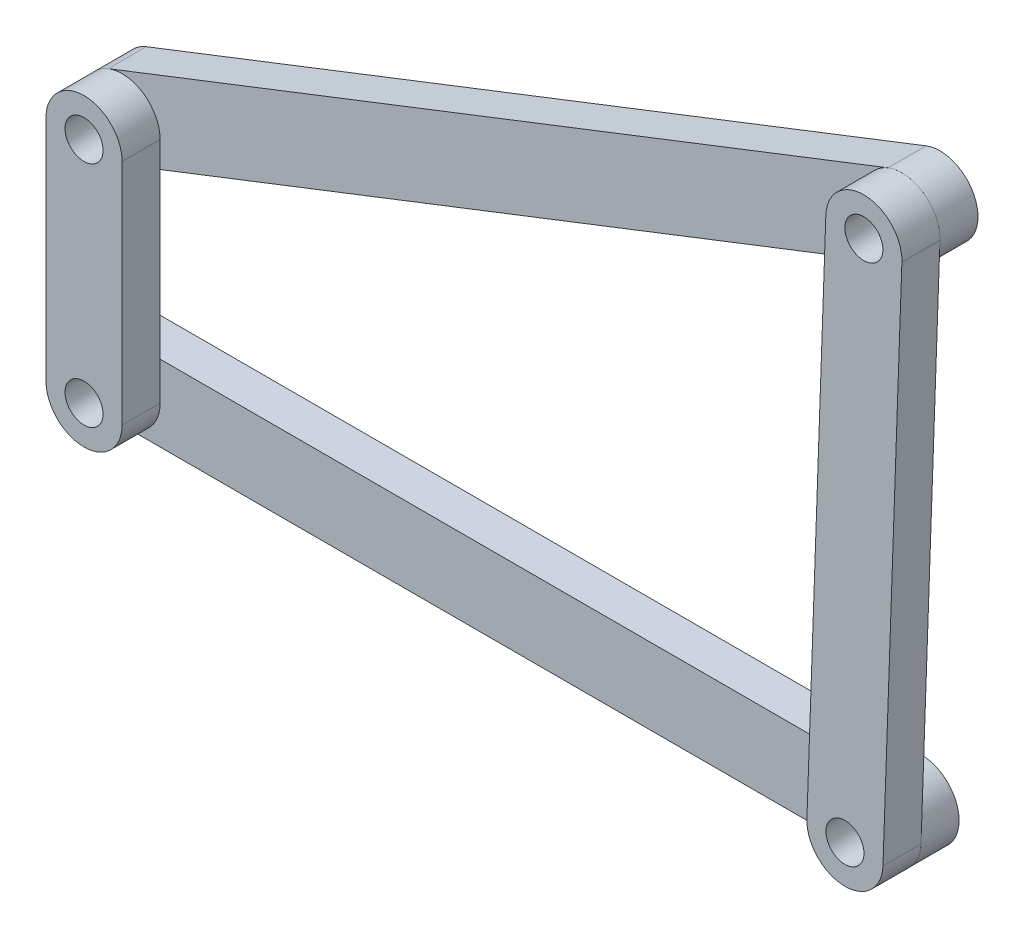
ISO-10303-21;
HEADER;
FILE_DESCRIPTION(('STEP AP214'),'2;1');
FILE_NAME('part.step','',(''),(''),'','','');
FILE_SCHEMA(('AUTOMOTIVE_DESIGN { 1 0 10303 214 1 1 1 1 }'));
ENDSEC;
DATA;
#1=APPLICATION_CONTEXT('core data for automotive mechanical design processes');
#2=APPLICATION_PROTOCOL_DEFINITION('international standard','automotive_design',2000,#1);
#3=PRODUCT_CONTEXT('',#1,'mechanical');
#4=PRODUCT('Part','Part','',(#3));
#5=PRODUCT_RELATED_PRODUCT_CATEGORY('part','',(#4));
#6=PRODUCT_DEFINITION_FORMATION('','',#4);
#7=PRODUCT_DEFINITION_CONTEXT('part definition',#1,'design');
#8=PRODUCT_DEFINITION('design','',#6,#7);
#9=PRODUCT_DEFINITION_SHAPE('','',#8);
#10=(LENGTH_UNIT() NAMED_UNIT(*) SI_UNIT(.MILLI.,.METRE.));
#11=(NAMED_UNIT(*) PLANE_ANGLE_UNIT() SI_UNIT($,.RADIAN.));
#12=(NAMED_UNIT(*) SI_UNIT($,.STERADIAN.) SOLID_ANGLE_UNIT());
#13=UNCERTAINTY_MEASURE_WITH_UNIT(LENGTH_MEASURE(1.E-05),#10,'distance_accuracy_value','');
#14=(GEOMETRIC_REPRESENTATION_CONTEXT(3) GLOBAL_UNCERTAINTY_ASSIGNED_CONTEXT((#13)) GLOBAL_UNIT_ASSIGNED_CONTEXT((#10,
#11,#12)) REPRESENTATION_CONTEXT('',''));
#15=CARTESIAN_POINT('',(0.,0.,0.));
#16=DIRECTION('',(0.,0.,1.));
#17=DIRECTION('',(1.,0.,0.));
#18=AXIS2_PLACEMENT_3D('',#15,#16,#17);
#19=CARTESIAN_POINT('',(0.,30.,0.));
#20=DIRECTION('',(0.,0.,-1.));
#21=DIRECTION('',(-1.,0.,0.));
#22=AXIS2_PLACEMENT_3D('',#19,#20,#21);
#23=PLANE('',#22);
#24=CARTESIAN_POINT('',(0.,30.,0.));
#25=DIRECTION('',(0.,0.,-1.));
#26=DIRECTION('',(-1.,0.,0.));
#27=AXIS2_PLACEMENT_3D('',#24,#25,#26);
#28=CIRCLE('',#27,2.5);
#29=CARTESIAN_POINT('',(-2.5,30.,0.));
#30=VERTEX_POINT('',#29);
#31=EDGE_CURVE('E114',#30,#30,#28,.T.);
#32=ORIENTED_EDGE('',*,*,#31,.F.);
#33=EDGE_LOOP('',(#32));
#34=FACE_BOUND('',#33,.T.);
#35=CARTESIAN_POINT('',(0.,30.,0.));
#36=DIRECTION('',(0.,0.,-1.));
#37=DIRECTION('',(-1.,0.,0.));
#38=AXIS2_PLACEMENT_3D('',#35,#36,#37);
#39=CIRCLE('',#38,5.);
#40=CARTESIAN_POINT('',(1.81617342499557,25.341511608865,0.));
#41=VERTEX_POINT('',#40);
#42=CARTESIAN_POINT('',(-1.81617342499557,34.658488391135,0.));
#43=VERTEX_POINT('',#42);
#44=EDGE_CURVE('E99',#41,#43,#39,.T.);
#45=ORIENTED_EDGE('',*,*,#44,.T.);
#46=DIRECTION('',(0.931697678227007,0.363234684999113,0.));
#47=VECTOR('',#46,1.);
#48=CARTESIAN_POINT('',(-1.81617342499557,34.658488391135,0.));
#49=LINE('',#48,#47);
#50=CARTESIAN_POINT('',(100.670571179975,74.6143037410375,0.));
#51=VERTEX_POINT('',#50);
#52=EDGE_CURVE('E94',#43,#51,#49,.T.);
#53=ORIENTED_EDGE('',*,*,#52,.T.);
#54=CARTESIAN_POINT('',(102.486744604971,69.9558153499025,0.));
#55=DIRECTION('',(0.,0.,-1.));
#56=DIRECTION('',(-1.,0.,0.));
#57=AXIS2_PLACEMENT_3D('',#54,#55,#56);
#58=CIRCLE('',#57,5.00000000000001);
#59=CARTESIAN_POINT('',(104.302918029966,65.2973269587674,0.));
#60=VERTEX_POINT('',#59);
#61=EDGE_CURVE('E97',#51,#60,#58,.T.);
#62=ORIENTED_EDGE('',*,*,#61,.T.);
#63=DIRECTION('',(-0.931697678227007,-0.363234684999113,0.));
#64=VECTOR('',#63,1.);
#65=CARTESIAN_POINT('',(1.81617342499557,25.341511608865,0.));
#66=LINE('',#65,#64);
#67=EDGE_CURVE('E64',#60,#41,#66,.T.);
#68=ORIENTED_EDGE('',*,*,#67,.T.);
#69=EDGE_LOOP('',(#45,#53,#62,#68));
#70=FACE_BOUND('',#69,.T.);
#71=CARTESIAN_POINT('',(102.486744604971,69.9558153499025,0.));
#72=DIRECTION('',(0.,0.,-1.));
#73=DIRECTION('',(-1.,0.,0.));
#74=AXIS2_PLACEMENT_3D('',#71,#72,#73);
#75=CIRCLE('',#74,2.50000000000001);
#76=CARTESIAN_POINT('',(99.9867446049707,69.9558153499025,0.));
#77=VERTEX_POINT('',#76);
#78=EDGE_CURVE('E129',#77,#77,#75,.T.);
#79=ORIENTED_EDGE('',*,*,#78,.F.);
#80=EDGE_LOOP('',(#79));
#81=FACE_BOUND('',#80,.T.);
#82=ADVANCED_FACE('F47',(#34,#70,#81),#23,.T.);
#83=CARTESIAN_POINT('',(-1.81617342499557,34.658488391135,0.));
#84=DIRECTION('',(0.363234684999113,-0.931697678227007,0.));
#85=DIRECTION('',(0.931697678227007,0.363234684999113,0.));
#86=AXIS2_PLACEMENT_3D('',#83,#84,#85);
#87=PLANE('',#86);
#88=DIRECTION('',(0.931697678227007,0.363234684999113,0.));
#89=VECTOR('',#88,1.);
#90=CARTESIAN_POINT('',(-1.81617342499557,34.658488391135,5.));
#91=LINE('',#90,#89);
#92=CARTESIAN_POINT('',(-1.81617342499557,34.658488391135,5.));
#93=VERTEX_POINT('',#92);
#94=CARTESIAN_POINT('',(100.670571179975,74.6143037410375,5.));
#95=VERTEX_POINT('',#94);
#96=EDGE_CURVE('E103',#93,#95,#91,.T.);
#97=ORIENTED_EDGE('',*,*,#96,.T.);
#98=DIRECTION('',(0.,0.,1.));
#99=VECTOR('',#98,1.);
#100=CARTESIAN_POINT('',(100.670571179975,74.6143037410375,0.));
#101=LINE('',#100,#99);
#102=EDGE_CURVE('E56',#51,#95,#101,.T.);
#103=ORIENTED_EDGE('',*,*,#102,.F.);
#104=ORIENTED_EDGE('',*,*,#52,.F.);
#105=DIRECTION('',(0.,0.,1.));
#106=VECTOR('',#105,1.);
#107=CARTESIAN_POINT('',(-1.81617342499557,34.658488391135,0.));
#108=LINE('',#107,#106);
#109=EDGE_CURVE('E12',#43,#93,#108,.T.);
#110=ORIENTED_EDGE('',*,*,#109,.T.);
#111=EDGE_LOOP('',(#97,#103,#104,#110));
#112=FACE_BOUND('',#111,.T.);
#113=ADVANCED_FACE('F102',(#112),#87,.F.);
#114=CARTESIAN_POINT('',(102.486744604971,69.9558153499025,0.));
#115=DIRECTION('',(0.,0.,1.));
#116=DIRECTION('',(1.,0.,0.));
#117=AXIS2_PLACEMENT_3D('',#114,#115,#116);
#118=CYLINDRICAL_SURFACE('',#117,5.00000000000001);
#119=CARTESIAN_POINT('',(102.486744604971,69.9558153499025,5.));
#120=DIRECTION('',(0.,0.,-1.));
#121=DIRECTION('',(-1.,0.,0.));
#122=AXIS2_PLACEMENT_3D('',#119,#120,#121);
#123=CIRCLE('',#122,5.00000000000001);
#124=CARTESIAN_POINT('',(104.302918029966,65.2973269587674,5.));
#125=VERTEX_POINT('',#124);
#126=EDGE_CURVE('E81',#95,#125,#123,.T.);
#127=ORIENTED_EDGE('',*,*,#126,.T.);
#128=DIRECTION('',(0.,0.,1.));
#129=VECTOR('',#128,1.);
#130=CARTESIAN_POINT('',(104.302918029966,65.2973269587674,0.));
#131=LINE('',#130,#129);
#132=EDGE_CURVE('E104',#60,#125,#131,.T.);
#133=ORIENTED_EDGE('',*,*,#132,.F.);
#134=ORIENTED_EDGE('',*,*,#61,.F.);
#135=ORIENTED_EDGE('',*,*,#102,.T.);
#136=EDGE_LOOP('',(#127,#133,#134,#135));
#137=FACE_BOUND('',#136,.T.);
#138=ADVANCED_FACE('F105',(#137),#118,.T.);
#139=CARTESIAN_POINT('',(0.,30.,0.));
#140=DIRECTION('',(0.,0.,1.));
#141=DIRECTION('',(1.,0.,0.));
#142=AXIS2_PLACEMENT_3D('',#139,#140,#141);
#143=CYLINDRICAL_SURFACE('',#142,5.);
#144=CARTESIAN_POINT('',(0.,30.,5.));
#145=DIRECTION('',(0.,0.,-1.));
#146=DIRECTION('',(-1.,0.,0.));
#147=AXIS2_PLACEMENT_3D('',#144,#145,#146);
#148=CIRCLE('',#147,5.);
#149=CARTESIAN_POINT('',(1.81617342499557,25.341511608865,5.));
#150=VERTEX_POINT('',#149);
#151=EDGE_CURVE('E111',#150,#93,#148,.T.);
#152=ORIENTED_EDGE('',*,*,#151,.T.);
#153=ORIENTED_EDGE('',*,*,#109,.F.);
#154=ORIENTED_EDGE('',*,*,#44,.F.);
#155=DIRECTION('',(0.,0.,1.));
#156=VECTOR('',#155,1.);
#157=CARTESIAN_POINT('',(1.81617342499557,25.341511608865,0.));
#158=LINE('',#157,#156);
#159=EDGE_CURVE('E107',#41,#150,#158,.T.);
#160=ORIENTED_EDGE('',*,*,#159,.T.);
#161=EDGE_LOOP('',(#152,#153,#154,#160));
#162=FACE_BOUND('',#161,.T.);
#163=ADVANCED_FACE('F49',(#162),#143,.T.);
#164=CARTESIAN_POINT('',(0.,30.,5.));
#165=DIRECTION('',(0.,0.,-1.));
#166=DIRECTION('',(-1.,0.,0.));
#167=AXIS2_PLACEMENT_3D('',#164,#165,#166);
#168=PLANE('',#167);
#169=ORIENTED_EDGE('',*,*,#151,.F.);
#170=DIRECTION('',(-0.931697678227007,-0.363234684999113,0.));
#171=VECTOR('',#170,1.);
#172=CARTESIAN_POINT('',(1.81617342499557,25.341511608865,5.));
#173=LINE('',#172,#171);
#174=EDGE_CURVE('E87',#125,#150,#173,.T.);
#175=ORIENTED_EDGE('',*,*,#174,.F.);
#176=ORIENTED_EDGE('',*,*,#126,.F.);
#177=ORIENTED_EDGE('',*,*,#96,.F.);
#178=EDGE_LOOP('',(#169,#175,#176,#177));
#179=FACE_BOUND('',#178,.T.);
#180=CARTESIAN_POINT('',(0.,30.,5.));
#181=DIRECTION('',(0.,0.,-1.));
#182=DIRECTION('',(-1.,0.,0.));
#183=AXIS2_PLACEMENT_3D('',#180,#181,#182);
#184=CIRCLE('',#183,2.5);
#185=CARTESIAN_POINT('',(-2.5,30.,5.));
#186=VERTEX_POINT('',#185);
#187=EDGE_CURVE('E126',#186,#186,#184,.T.);
#188=ORIENTED_EDGE('',*,*,#187,.T.);
#189=EDGE_LOOP('',(#188));
#190=FACE_BOUND('',#189,.T.);
#191=CARTESIAN_POINT('',(102.486744604971,69.9558153499025,5.));
#192=DIRECTION('',(0.,0.,-1.));
#193=DIRECTION('',(-1.,0.,0.));
#194=AXIS2_PLACEMENT_3D('',#191,#192,#193);
#195=CIRCLE('',#194,2.50000000000001);
#196=CARTESIAN_POINT('',(99.9867446049707,69.9558153499025,5.));
#197=VERTEX_POINT('',#196);
#198=EDGE_CURVE('E132',#197,#197,#195,.T.);
#199=ORIENTED_EDGE('',*,*,#198,.T.);
#200=EDGE_LOOP('',(#199));
#201=FACE_BOUND('',#200,.T.);
#202=ADVANCED_FACE('F122',(#179,#190,#201),#168,.F.);
#203=CARTESIAN_POINT('',(102.486744604971,69.9558153499025,0.));
#204=DIRECTION('',(0.,0.,1.));
#205=DIRECTION('',(1.,0.,0.));
#206=AXIS2_PLACEMENT_3D('',#203,#204,#205);
#207=CYLINDRICAL_SURFACE('',#206,2.50000000000001);
#208=ORIENTED_EDGE('',*,*,#78,.T.);
#209=EDGE_LOOP('',(#208));
#210=FACE_BOUND('',#209,.T.);
#211=ORIENTED_EDGE('',*,*,#198,.F.);
#212=EDGE_LOOP('',(#211));
#213=FACE_BOUND('',#212,.T.);
#214=ADVANCED_FACE('F138',(#210,#213),#207,.F.);
#215=CARTESIAN_POINT('',(0.,30.,0.));
#216=DIRECTION('',(0.,0.,1.));
#217=DIRECTION('',(1.,0.,0.));
#218=AXIS2_PLACEMENT_3D('',#215,#216,#217);
#219=CYLINDRICAL_SURFACE('',#218,2.5);
#220=ORIENTED_EDGE('',*,*,#31,.T.);
#221=EDGE_LOOP('',(#220));
#222=FACE_BOUND('',#221,.T.);
#223=ORIENTED_EDGE('',*,*,#187,.F.);
#224=EDGE_LOOP('',(#223));
#225=FACE_BOUND('',#224,.T.);
#226=ADVANCED_FACE('F150',(#222,#225),#219,.F.);
#227=CARTESIAN_POINT('',(1.81617342499557,25.341511608865,0.));
#228=DIRECTION('',(-0.363234684999113,0.931697678227007,0.));
#229=DIRECTION('',(-0.931697678227007,-0.363234684999113,0.));
#230=AXIS2_PLACEMENT_3D('',#227,#228,#229);
#231=PLANE('',#230);
#232=ORIENTED_EDGE('',*,*,#174,.T.);
#233=ORIENTED_EDGE('',*,*,#159,.F.);
#234=ORIENTED_EDGE('',*,*,#67,.F.);
#235=ORIENTED_EDGE('',*,*,#132,.T.);
#236=EDGE_LOOP('',(#232,#233,#234,#235));
#237=FACE_BOUND('',#236,.T.);
#238=ADVANCED_FACE('F119',(#237),#231,.F.);
#239=CLOSED_SHELL('',(#82,#113,#138,#163,#202,#214,#226,#238));
#240=MANIFOLD_SOLID_BREP('B2',#239);
#241=CARTESIAN_POINT('',(102.486744604971,69.9558153499025,10.));
#242=DIRECTION('',(0.,0.,1.));
#243=DIRECTION('',(1.,0.,0.));
#244=AXIS2_PLACEMENT_3D('',#241,#242,#243);
#245=PLANE('',#244);
#246=CARTESIAN_POINT('',(100.,0.,10.));
#247=DIRECTION('',(0.,0.,1.));
#248=DIRECTION('',(1.,0.,0.));
#249=AXIS2_PLACEMENT_3D('',#246,#247,#248);
#250=CIRCLE('',#249,2.5);
#251=CARTESIAN_POINT('',(102.5,0.,10.));
#252=VERTEX_POINT('',#251);
#253=EDGE_CURVE('E289',#252,#252,#250,.T.);
#254=ORIENTED_EDGE('',*,*,#253,.F.);
#255=EDGE_LOOP('',(#254));
#256=FACE_BOUND('',#255,.T.);
#257=CARTESIAN_POINT('',(102.486744604971,69.9558153499025,10.));
#258=DIRECTION('',(0.,0.,1.));
#259=DIRECTION('',(1.,0.,0.));
#260=AXIS2_PLACEMENT_3D('',#257,#258,#259);
#261=CIRCLE('',#260,5.);
#262=CARTESIAN_POINT('',(107.483588558535,69.7781907352617,10.));
#263=VERTEX_POINT('',#262);
#264=CARTESIAN_POINT('',(97.4899006514063,70.1334399645432,10.));
#265=VERTEX_POINT('',#264);
#266=EDGE_CURVE('E274',#263,#265,#261,.T.);
#267=ORIENTED_EDGE('',*,*,#266,.T.);
#268=DIRECTION('',(-0.035524922928153,-0.999368790712892,0.));
#269=VECTOR('',#268,1.);
#270=CARTESIAN_POINT('',(97.4899006514063,70.1334399645432,10.));
#271=LINE('',#270,#269);
#272=CARTESIAN_POINT('',(95.0031560464355,0.177624614640765,10.));
#273=VERTEX_POINT('',#272);
#274=EDGE_CURVE('E269',#265,#273,#271,.T.);
#275=ORIENTED_EDGE('',*,*,#274,.T.);
#276=CARTESIAN_POINT('',(100.,0.,10.));
#277=DIRECTION('',(0.,0.,1.));
#278=DIRECTION('',(1.,0.,0.));
#279=AXIS2_PLACEMENT_3D('',#276,#277,#278);
#280=CIRCLE('',#279,5.);
#281=CARTESIAN_POINT('',(104.996843953564,-0.177624614640765,10.));
#282=VERTEX_POINT('',#281);
#283=EDGE_CURVE('E272',#273,#282,#280,.T.);
#284=ORIENTED_EDGE('',*,*,#283,.T.);
#285=DIRECTION('',(0.035524922928153,0.999368790712892,0.));
#286=VECTOR('',#285,1.);
#287=CARTESIAN_POINT('',(107.483588558535,69.7781907352617,10.));
#288=LINE('',#287,#286);
#289=EDGE_CURVE('E239',#282,#263,#288,.T.);
#290=ORIENTED_EDGE('',*,*,#289,.T.);
#291=EDGE_LOOP('',(#267,#275,#284,#290));
#292=FACE_BOUND('',#291,.T.);
#293=CARTESIAN_POINT('',(102.486744604971,69.9558153499025,10.));
#294=DIRECTION('',(0.,0.,1.));
#295=DIRECTION('',(1.,0.,0.));
#296=AXIS2_PLACEMENT_3D('',#293,#294,#295);
#297=CIRCLE('',#296,2.50000000000001);
#298=CARTESIAN_POINT('',(104.986744604971,69.9558153499025,10.));
#299=VERTEX_POINT('',#298);
#300=EDGE_CURVE('E304',#299,#299,#297,.T.);
#301=ORIENTED_EDGE('',*,*,#300,.F.);
#302=EDGE_LOOP('',(#301));
#303=FACE_BOUND('',#302,.T.);
#304=ADVANCED_FACE('F222',(#256,#292,#303),#245,.T.);
#305=CARTESIAN_POINT('',(102.486744604971,69.9558153499025,5.));
#306=DIRECTION('',(0.,0.,1.));
#307=DIRECTION('',(1.,0.,0.));
#308=AXIS2_PLACEMENT_3D('',#305,#306,#307);
#309=PLANE('',#308);
#310=CARTESIAN_POINT('',(102.486744604971,69.9558153499025,5.));
#311=DIRECTION('',(0.,0.,1.));
#312=DIRECTION('',(1.,0.,0.));
#313=AXIS2_PLACEMENT_3D('',#310,#311,#312);
#314=CIRCLE('',#313,5.);
#315=CARTESIAN_POINT('',(107.483588558535,69.7781907352617,5.));
#316=VERTEX_POINT('',#315);
#317=CARTESIAN_POINT('',(97.4899006514063,70.1334399645432,5.));
#318=VERTEX_POINT('',#317);
#319=EDGE_CURVE('E286',#316,#318,#314,.T.);
#320=ORIENTED_EDGE('',*,*,#319,.F.);
#321=DIRECTION('',(0.035524922928153,0.999368790712892,0.));
#322=VECTOR('',#321,1.);
#323=CARTESIAN_POINT('',(107.483588558535,69.7781907352617,5.));
#324=LINE('',#323,#322);
#325=CARTESIAN_POINT('',(104.996843953564,-0.177624614640765,5.));
#326=VERTEX_POINT('',#325);
#327=EDGE_CURVE('E262',#326,#316,#324,.T.);
#328=ORIENTED_EDGE('',*,*,#327,.F.);
#329=CARTESIAN_POINT('',(100.,0.,5.));
#330=DIRECTION('',(0.,0.,1.));
#331=DIRECTION('',(1.,0.,0.));
#332=AXIS2_PLACEMENT_3D('',#329,#330,#331);
#333=CIRCLE('',#332,5.);
#334=CARTESIAN_POINT('',(95.0031560464355,0.177624614640765,5.));
#335=VERTEX_POINT('',#334);
#336=EDGE_CURVE('E256',#335,#326,#333,.T.);
#337=ORIENTED_EDGE('',*,*,#336,.F.);
#338=DIRECTION('',(-0.035524922928153,-0.999368790712892,0.));
#339=VECTOR('',#338,1.);
#340=CARTESIAN_POINT('',(97.4899006514063,70.1334399645432,5.));
#341=LINE('',#340,#339);
#342=EDGE_CURVE('E278',#318,#335,#341,.T.);
#343=ORIENTED_EDGE('',*,*,#342,.F.);
#344=EDGE_LOOP('',(#320,#328,#337,#343));
#345=FACE_BOUND('',#344,.T.);
#346=CARTESIAN_POINT('',(100.,0.,5.));
#347=DIRECTION('',(0.,0.,1.));
#348=DIRECTION('',(1.,0.,0.));
#349=AXIS2_PLACEMENT_3D('',#346,#347,#348);
#350=CIRCLE('',#349,2.5);
#351=CARTESIAN_POINT('',(102.5,0.,5.));
#352=VERTEX_POINT('',#351);
#353=EDGE_CURVE('E301',#352,#352,#350,.T.);
#354=ORIENTED_EDGE('',*,*,#353,.T.);
#355=EDGE_LOOP('',(#354));
#356=FACE_BOUND('',#355,.T.);
#357=CARTESIAN_POINT('',(102.486744604971,69.9558153499025,5.));
#358=DIRECTION('',(0.,0.,1.));
#359=DIRECTION('',(1.,0.,0.));
#360=AXIS2_PLACEMENT_3D('',#357,#358,#359);
#361=CIRCLE('',#360,2.50000000000001);
#362=CARTESIAN_POINT('',(104.986744604971,69.9558153499025,5.));
#363=VERTEX_POINT('',#362);
#364=EDGE_CURVE('E307',#363,#363,#361,.T.);
#365=ORIENTED_EDGE('',*,*,#364,.T.);
#366=EDGE_LOOP('',(#365));
#367=FACE_BOUND('',#366,.T.);
#368=ADVANCED_FACE('F297',(#345,#356,#367),#309,.F.);
#369=CARTESIAN_POINT('',(102.486744604971,69.9558153499025,10.));
#370=DIRECTION('',(0.,0.,-1.));
#371=DIRECTION('',(-1.,0.,0.));
#372=AXIS2_PLACEMENT_3D('',#369,#370,#371);
#373=CYLINDRICAL_SURFACE('',#372,5.);
#374=ORIENTED_EDGE('',*,*,#319,.T.);
#375=DIRECTION('',(0.,0.,-1.));
#376=VECTOR('',#375,1.);
#377=CARTESIAN_POINT('',(97.4899006514063,70.1334399645432,10.));
#378=LINE('',#377,#376);
#379=EDGE_CURVE('E45',#265,#318,#378,.T.);
#380=ORIENTED_EDGE('',*,*,#379,.F.);
#381=ORIENTED_EDGE('',*,*,#266,.F.);
#382=DIRECTION('',(0.,0.,-1.));
#383=VECTOR('',#382,1.);
#384=CARTESIAN_POINT('',(107.483588558535,69.7781907352617,10.));
#385=LINE('',#384,#383);
#386=EDGE_CURVE('E282',#263,#316,#385,.T.);
#387=ORIENTED_EDGE('',*,*,#386,.T.);
#388=EDGE_LOOP('',(#374,#380,#381,#387));
#389=FACE_BOUND('',#388,.T.);
#390=ADVANCED_FACE('F224',(#389),#373,.T.);
#391=CARTESIAN_POINT('',(97.4899006514063,70.1334399645432,10.));
#392=DIRECTION('',(0.999368790712892,-0.035524922928153,0.));
#393=DIRECTION('',(0.035524922928153,0.999368790712892,0.));
#394=AXIS2_PLACEMENT_3D('',#391,#392,#393);
#395=PLANE('',#394);
#396=ORIENTED_EDGE('',*,*,#342,.T.);
#397=DIRECTION('',(0.,0.,-1.));
#398=VECTOR('',#397,1.);
#399=CARTESIAN_POINT('',(95.0031560464355,0.177624614640765,10.));
#400=LINE('',#399,#398);
#401=EDGE_CURVE('E231',#273,#335,#400,.T.);
#402=ORIENTED_EDGE('',*,*,#401,.F.);
#403=ORIENTED_EDGE('',*,*,#274,.F.);
#404=ORIENTED_EDGE('',*,*,#379,.T.);
#405=EDGE_LOOP('',(#396,#402,#403,#404));
#406=FACE_BOUND('',#405,.T.);
#407=ADVANCED_FACE('F277',(#406),#395,.F.);
#408=CARTESIAN_POINT('',(100.,0.,10.));
#409=DIRECTION('',(0.,0.,-1.));
#410=DIRECTION('',(-1.,0.,0.));
#411=AXIS2_PLACEMENT_3D('',#408,#409,#410);
#412=CYLINDRICAL_SURFACE('',#411,5.);
#413=ORIENTED_EDGE('',*,*,#336,.T.);
#414=DIRECTION('',(0.,0.,-1.));
#415=VECTOR('',#414,1.);
#416=CARTESIAN_POINT('',(104.996843953564,-0.177624614640765,10.));
#417=LINE('',#416,#415);
#418=EDGE_CURVE('E279',#282,#326,#417,.T.);
#419=ORIENTED_EDGE('',*,*,#418,.F.);
#420=ORIENTED_EDGE('',*,*,#283,.F.);
#421=ORIENTED_EDGE('',*,*,#401,.T.);
#422=EDGE_LOOP('',(#413,#419,#420,#421));
#423=FACE_BOUND('',#422,.T.);
#424=ADVANCED_FACE('F280',(#423),#412,.T.);
#425=CARTESIAN_POINT('',(107.483588558535,69.7781907352617,10.));
#426=DIRECTION('',(-0.999368790712892,0.035524922928153,0.));
#427=DIRECTION('',(-0.035524922928153,-0.999368790712893,0.));
#428=AXIS2_PLACEMENT_3D('',#425,#426,#427);
#429=PLANE('',#428);
#430=ORIENTED_EDGE('',*,*,#327,.T.);
#431=ORIENTED_EDGE('',*,*,#386,.F.);
#432=ORIENTED_EDGE('',*,*,#289,.F.);
#433=ORIENTED_EDGE('',*,*,#418,.T.);
#434=EDGE_LOOP('',(#430,#431,#432,#433));
#435=FACE_BOUND('',#434,.T.);
#436=ADVANCED_FACE('F294',(#435),#429,.F.);
#437=CARTESIAN_POINT('',(100.,0.,10.));
#438=DIRECTION('',(0.,0.,-1.));
#439=DIRECTION('',(-1.,0.,0.));
#440=AXIS2_PLACEMENT_3D('',#437,#438,#439);
#441=CYLINDRICAL_SURFACE('',#440,2.5);
#442=ORIENTED_EDGE('',*,*,#253,.T.);
#443=EDGE_LOOP('',(#442));
#444=FACE_BOUND('',#443,.T.);
#445=ORIENTED_EDGE('',*,*,#353,.F.);
#446=EDGE_LOOP('',(#445));
#447=FACE_BOUND('',#446,.T.);
#448=ADVANCED_FACE('F324',(#444,#447),#441,.F.);
#449=CARTESIAN_POINT('',(102.486744604971,69.9558153499025,10.));
#450=DIRECTION('',(0.,0.,-1.));
#451=DIRECTION('',(-1.,0.,0.));
#452=AXIS2_PLACEMENT_3D('',#449,#450,#451);
#453=CYLINDRICAL_SURFACE('',#452,2.50000000000001);
#454=ORIENTED_EDGE('',*,*,#300,.T.);
#455=EDGE_LOOP('',(#454));
#456=FACE_BOUND('',#455,.T.);
#457=ORIENTED_EDGE('',*,*,#364,.F.);
#458=EDGE_LOOP('',(#457));
#459=FACE_BOUND('',#458,.T.);
#460=ADVANCED_FACE('F313',(#456,#459),#453,.F.);
#461=CLOSED_SHELL('',(#304,#368,#390,#407,#424,#436,#448,#460));
#462=MANIFOLD_SOLID_BREP('B6',#461);
#463=CARTESIAN_POINT('',(0.,0.,5.));
#464=DIRECTION('',(0.,0.,1.));
#465=DIRECTION('',(1.,0.,0.));
#466=AXIS2_PLACEMENT_3D('',#463,#464,#465);
#467=PLANE('',#466);
#468=CARTESIAN_POINT('',(0.,0.,5.));
#469=DIRECTION('',(0.,0.,1.));
#470=DIRECTION('',(1.,0.,0.));
#471=AXIS2_PLACEMENT_3D('',#468,#469,#470);
#472=CIRCLE('',#471,2.5);
#473=CARTESIAN_POINT('',(2.5,0.,5.));
#474=VERTEX_POINT('',#473);
#475=EDGE_CURVE('E463',#474,#474,#472,.T.);
#476=ORIENTED_EDGE('',*,*,#475,.F.);
#477=EDGE_LOOP('',(#476));
#478=FACE_BOUND('',#477,.T.);
#479=CARTESIAN_POINT('',(0.,0.,5.));
#480=DIRECTION('',(0.,0.,1.));
#481=DIRECTION('',(1.,0.,0.));
#482=AXIS2_PLACEMENT_3D('',#479,#480,#481);
#483=CIRCLE('',#482,5.);
#484=CARTESIAN_POINT('',(0.,5.,5.));
#485=VERTEX_POINT('',#484);
#486=CARTESIAN_POINT('',(0.,-5.,5.));
#487=VERTEX_POINT('',#486);
#488=EDGE_CURVE('E448',#485,#487,#483,.T.);
#489=ORIENTED_EDGE('',*,*,#488,.T.);
#490=DIRECTION('',(1.,0.,0.));
#491=VECTOR('',#490,1.);
#492=CARTESIAN_POINT('',(0.,-5.,5.));
#493=LINE('',#492,#491);
#494=CARTESIAN_POINT('',(100.,-5.,5.));
#495=VERTEX_POINT('',#494);
#496=EDGE_CURVE('E443',#487,#495,#493,.T.);
#497=ORIENTED_EDGE('',*,*,#496,.T.);
#498=CARTESIAN_POINT('',(100.,0.,5.));
#499=DIRECTION('',(0.,0.,1.));
#500=DIRECTION('',(1.,0.,0.));
#501=AXIS2_PLACEMENT_3D('',#498,#499,#500);
#502=CIRCLE('',#501,5.);
#503=CARTESIAN_POINT('',(100.,5.,5.));
#504=VERTEX_POINT('',#503);
#505=EDGE_CURVE('E446',#495,#504,#502,.T.);
#506=ORIENTED_EDGE('',*,*,#505,.T.);
#507=DIRECTION('',(-1.,0.,0.));
#508=VECTOR('',#507,1.);
#509=CARTESIAN_POINT('',(0.,5.,5.));
#510=LINE('',#509,#508);
#511=EDGE_CURVE('E413',#504,#485,#510,.T.);
#512=ORIENTED_EDGE('',*,*,#511,.T.);
#513=EDGE_LOOP('',(#489,#497,#506,#512));
#514=FACE_BOUND('',#513,.T.);
#515=CARTESIAN_POINT('',(100.,0.,5.));
#516=DIRECTION('',(0.,0.,1.));
#517=DIRECTION('',(1.,0.,0.));
#518=AXIS2_PLACEMENT_3D('',#515,#516,#517);
#519=CIRCLE('',#518,2.5);
#520=CARTESIAN_POINT('',(102.5,0.,5.));
#521=VERTEX_POINT('',#520);
#522=EDGE_CURVE('E478',#521,#521,#519,.T.);
#523=ORIENTED_EDGE('',*,*,#522,.F.);
#524=EDGE_LOOP('',(#523));
#525=FACE_BOUND('',#524,.T.);
#526=ADVANCED_FACE('F396',(#478,#514,#525),#467,.T.);
#527=CARTESIAN_POINT('',(0.,0.,5.));
#528=DIRECTION('',(0.,0.,-1.));
#529=DIRECTION('',(-1.,0.,0.));
#530=AXIS2_PLACEMENT_3D('',#527,#528,#529);
#531=CYLINDRICAL_SURFACE('',#530,5.);
#532=CARTESIAN_POINT('',(0.,0.,0.));
#533=DIRECTION('',(0.,0.,1.));
#534=DIRECTION('',(1.,0.,0.));
#535=AXIS2_PLACEMENT_3D('',#532,#533,#534);
#536=CIRCLE('',#535,5.);
#537=CARTESIAN_POINT('',(0.,5.,0.));
#538=VERTEX_POINT('',#537);
#539=CARTESIAN_POINT('',(0.,-5.,0.));
#540=VERTEX_POINT('',#539);
#541=EDGE_CURVE('E460',#538,#540,#536,.T.);
#542=ORIENTED_EDGE('',*,*,#541,.T.);
#543=DIRECTION('',(0.,0.,-1.));
#544=VECTOR('',#543,1.);
#545=CARTESIAN_POINT('',(0.,-5.,5.));
#546=LINE('',#545,#544);
#547=EDGE_CURVE('E220',#487,#540,#546,.T.);
#548=ORIENTED_EDGE('',*,*,#547,.F.);
#549=ORIENTED_EDGE('',*,*,#488,.F.);
#550=DIRECTION('',(0.,0.,-1.));
#551=VECTOR('',#550,1.);
#552=CARTESIAN_POINT('',(0.,5.,5.));
#553=LINE('',#552,#551);
#554=EDGE_CURVE('E456',#485,#538,#553,.T.);
#555=ORIENTED_EDGE('',*,*,#554,.T.);
#556=EDGE_LOOP('',(#542,#548,#549,#555));
#557=FACE_BOUND('',#556,.T.);
#558=ADVANCED_FACE('F398',(#557),#531,.T.);
#559=CARTESIAN_POINT('',(0.,-5.,5.));
#560=DIRECTION('',(0.,1.,0.));
#561=DIRECTION('',(0.,0.,1.));
#562=AXIS2_PLACEMENT_3D('',#559,#560,#561);
#563=PLANE('',#562);
#564=DIRECTION('',(1.,0.,0.));
#565=VECTOR('',#564,1.);
#566=CARTESIAN_POINT('',(0.,-5.,0.));
#567=LINE('',#566,#565);
#568=CARTESIAN_POINT('',(100.,-5.,0.));
#569=VERTEX_POINT('',#568);
#570=EDGE_CURVE('E452',#540,#569,#567,.T.);
#571=ORIENTED_EDGE('',*,*,#570,.T.);
#572=DIRECTION('',(0.,0.,-1.));
#573=VECTOR('',#572,1.);
#574=CARTESIAN_POINT('',(100.,-5.,5.));
#575=LINE('',#574,#573);
#576=EDGE_CURVE('E405',#495,#569,#575,.T.);
#577=ORIENTED_EDGE('',*,*,#576,.F.);
#578=ORIENTED_EDGE('',*,*,#496,.F.);
#579=ORIENTED_EDGE('',*,*,#547,.T.);
#580=EDGE_LOOP('',(#571,#577,#578,#579));
#581=FACE_BOUND('',#580,.T.);
#582=ADVANCED_FACE('F451',(#581),#563,.F.);
#583=CARTESIAN_POINT('',(100.,0.,5.));
#584=DIRECTION('',(0.,0.,-1.));
#585=DIRECTION('',(-1.,0.,0.));
#586=AXIS2_PLACEMENT_3D('',#583,#584,#585);
#587=CYLINDRICAL_SURFACE('',#586,5.);
#588=CARTESIAN_POINT('',(100.,0.,0.));
#589=DIRECTION('',(0.,0.,1.));
#590=DIRECTION('',(1.,0.,0.));
#591=AXIS2_PLACEMENT_3D('',#588,#589,#590);
#592=CIRCLE('',#591,5.);
#593=CARTESIAN_POINT('',(100.,5.,0.));
#594=VERTEX_POINT('',#593);
#595=EDGE_CURVE('E430',#569,#594,#592,.T.);
#596=ORIENTED_EDGE('',*,*,#595,.T.);
#597=DIRECTION('',(0.,0.,-1.));
#598=VECTOR('',#597,1.);
#599=CARTESIAN_POINT('',(100.,5.,5.));
#600=LINE('',#599,#598);
#601=EDGE_CURVE('E453',#504,#594,#600,.T.);
#602=ORIENTED_EDGE('',*,*,#601,.F.);
#603=ORIENTED_EDGE('',*,*,#505,.F.);
#604=ORIENTED_EDGE('',*,*,#576,.T.);
#605=EDGE_LOOP('',(#596,#602,#603,#604));
#606=FACE_BOUND('',#605,.T.);
#607=ADVANCED_FACE('F454',(#606),#587,.T.);
#608=CARTESIAN_POINT('',(0.,5.,5.));
#609=DIRECTION('',(0.,-1.,0.));
#610=DIRECTION('',(0.,0.,-1.));
#611=AXIS2_PLACEMENT_3D('',#608,#609,#610);
#612=PLANE('',#611);
#613=DIRECTION('',(-1.,0.,0.));
#614=VECTOR('',#613,1.);
#615=CARTESIAN_POINT('',(0.,5.,0.));
#616=LINE('',#615,#614);
#617=EDGE_CURVE('E436',#594,#538,#616,.T.);
#618=ORIENTED_EDGE('',*,*,#617,.T.);
#619=ORIENTED_EDGE('',*,*,#554,.F.);
#620=ORIENTED_EDGE('',*,*,#511,.F.);
#621=ORIENTED_EDGE('',*,*,#601,.T.);
#622=EDGE_LOOP('',(#618,#619,#620,#621));
#623=FACE_BOUND('',#622,.T.);
#624=ADVANCED_FACE('F468',(#623),#612,.F.);
#625=CARTESIAN_POINT('',(0.,0.,5.));
#626=DIRECTION('',(0.,0.,-1.));
#627=DIRECTION('',(-1.,0.,0.));
#628=AXIS2_PLACEMENT_3D('',#625,#626,#627);
#629=CYLINDRICAL_SURFACE('',#628,2.5);
#630=ORIENTED_EDGE('',*,*,#475,.T.);
#631=EDGE_LOOP('',(#630));
#632=FACE_BOUND('',#631,.T.);
#633=CARTESIAN_POINT('',(0.,0.,0.));
#634=DIRECTION('',(0.,0.,1.));
#635=DIRECTION('',(1.,0.,0.));
#636=AXIS2_PLACEMENT_3D('',#633,#634,#635);
#637=CIRCLE('',#636,2.5);
#638=CARTESIAN_POINT('',(2.5,0.,0.));
#639=VERTEX_POINT('',#638);
#640=EDGE_CURVE('E475',#639,#639,#637,.T.);
#641=ORIENTED_EDGE('',*,*,#640,.F.);
#642=EDGE_LOOP('',(#641));
#643=FACE_BOUND('',#642,.T.);
#644=ADVANCED_FACE('F502',(#632,#643),#629,.F.);
#645=CARTESIAN_POINT('',(100.,0.,5.));
#646=DIRECTION('',(0.,0.,-1.));
#647=DIRECTION('',(-1.,0.,0.));
#648=AXIS2_PLACEMENT_3D('',#645,#646,#647);
#649=CYLINDRICAL_SURFACE('',#648,2.5);
#650=ORIENTED_EDGE('',*,*,#522,.T.);
#651=EDGE_LOOP('',(#650));
#652=FACE_BOUND('',#651,.T.);
#653=CARTESIAN_POINT('',(100.,0.,0.));
#654=DIRECTION('',(0.,0.,1.));
#655=DIRECTION('',(1.,0.,0.));
#656=AXIS2_PLACEMENT_3D('',#653,#654,#655);
#657=CIRCLE('',#656,2.5);
#658=CARTESIAN_POINT('',(102.5,0.,0.));
#659=VERTEX_POINT('',#658);
#660=EDGE_CURVE('E481',#659,#659,#657,.T.);
#661=ORIENTED_EDGE('',*,*,#660,.F.);
#662=EDGE_LOOP('',(#661));
#663=FACE_BOUND('',#662,.T.);
#664=ADVANCED_FACE('F487',(#652,#663),#649,.F.);
#665=CARTESIAN_POINT('',(0.,0.,0.));
#666=DIRECTION('',(0.,0.,1.));
#667=DIRECTION('',(1.,0.,0.));
#668=AXIS2_PLACEMENT_3D('',#665,#666,#667);
#669=PLANE('',#668);
#670=ORIENTED_EDGE('',*,*,#541,.F.);
#671=ORIENTED_EDGE('',*,*,#617,.F.);
#672=ORIENTED_EDGE('',*,*,#595,.F.);
#673=ORIENTED_EDGE('',*,*,#570,.F.);
#674=EDGE_LOOP('',(#670,#671,#672,#673));
#675=FACE_BOUND('',#674,.T.);
#676=ORIENTED_EDGE('',*,*,#640,.T.);
#677=EDGE_LOOP('',(#676));
#678=FACE_BOUND('',#677,.T.);
#679=ORIENTED_EDGE('',*,*,#660,.T.);
#680=EDGE_LOOP('',(#679));
#681=FACE_BOUND('',#680,.T.);
#682=ADVANCED_FACE('F471',(#675,#678,#681),#669,.F.);
#683=CLOSED_SHELL('',(#526,#558,#582,#607,#624,#644,#664,#682));
#684=MANIFOLD_SOLID_BREP('B39',#683);
#685=CARTESIAN_POINT('',(0.,0.,10.));
#686=DIRECTION('',(0.,0.,1.));
#687=DIRECTION('',(1.,0.,0.));
#688=AXIS2_PLACEMENT_3D('',#685,#686,#687);
#689=PLANE('',#688);
#690=CARTESIAN_POINT('',(0.,0.,10.));
#691=DIRECTION('',(0.,0.,1.));
#692=DIRECTION('',(1.,0.,0.));
#693=AXIS2_PLACEMENT_3D('',#690,#691,#692);
#694=CIRCLE('',#693,2.5);
#695=CARTESIAN_POINT('',(2.5,0.,10.));
#696=VERTEX_POINT('',#695);
#697=EDGE_CURVE('E628',#696,#696,#694,.T.);
#698=ORIENTED_EDGE('',*,*,#697,.F.);
#699=EDGE_LOOP('',(#698));
#700=FACE_BOUND('',#699,.T.);
#701=CARTESIAN_POINT('',(0.,0.,10.));
#702=DIRECTION('',(0.,0.,1.));
#703=DIRECTION('',(1.,0.,0.));
#704=AXIS2_PLACEMENT_3D('',#701,#702,#703);
#705=CIRCLE('',#704,5.);
#706=CARTESIAN_POINT('',(-5.,0.,10.));
#707=VERTEX_POINT('',#706);
#708=CARTESIAN_POINT('',(5.,0.,10.));
#709=VERTEX_POINT('',#708);
#710=EDGE_CURVE('E613',#707,#709,#705,.T.);
#711=ORIENTED_EDGE('',*,*,#710,.T.);
#712=DIRECTION('',(0.,1.,0.));
#713=VECTOR('',#712,1.);
#714=CARTESIAN_POINT('',(5.,0.,10.));
#715=LINE('',#714,#713);
#716=CARTESIAN_POINT('',(5.,30.,10.));
#717=VERTEX_POINT('',#716);
#718=EDGE_CURVE('E608',#709,#717,#715,.T.);
#719=ORIENTED_EDGE('',*,*,#718,.T.);
#720=CARTESIAN_POINT('',(0.,30.,10.));
#721=DIRECTION('',(0.,0.,1.));
#722=DIRECTION('',(1.,0.,0.));
#723=AXIS2_PLACEMENT_3D('',#720,#721,#722);
#724=CIRCLE('',#723,5.);
#725=CARTESIAN_POINT('',(-5.,30.,10.));
#726=VERTEX_POINT('',#725);
#727=EDGE_CURVE('E611',#717,#726,#724,.T.);
#728=ORIENTED_EDGE('',*,*,#727,.T.);
#729=DIRECTION('',(0.,-1.,0.));
#730=VECTOR('',#729,1.);
#731=CARTESIAN_POINT('',(-5.,0.,10.));
#732=LINE('',#731,#730);
#733=EDGE_CURVE('E578',#726,#707,#732,.T.);
#734=ORIENTED_EDGE('',*,*,#733,.T.);
#735=EDGE_LOOP('',(#711,#719,#728,#734));
#736=FACE_BOUND('',#735,.T.);
#737=CARTESIAN_POINT('',(0.,30.,10.));
#738=DIRECTION('',(0.,0.,1.));
#739=DIRECTION('',(1.,0.,0.));
#740=AXIS2_PLACEMENT_3D('',#737,#738,#739);
#741=CIRCLE('',#740,2.5);
#742=CARTESIAN_POINT('',(2.5,30.,10.));
#743=VERTEX_POINT('',#742);
#744=EDGE_CURVE('E643',#743,#743,#741,.T.);
#745=ORIENTED_EDGE('',*,*,#744,.F.);
#746=EDGE_LOOP('',(#745));
#747=FACE_BOUND('',#746,.T.);
#748=ADVANCED_FACE('F561',(#700,#736,#747),#689,.T.);
#749=CARTESIAN_POINT('',(0.,0.,5.));
#750=DIRECTION('',(0.,0.,1.));
#751=DIRECTION('',(1.,0.,0.));
#752=AXIS2_PLACEMENT_3D('',#749,#750,#751);
#753=PLANE('',#752);
#754=CARTESIAN_POINT('',(0.,0.,5.));
#755=DIRECTION('',(0.,0.,1.));
#756=DIRECTION('',(1.,0.,0.));
#757=AXIS2_PLACEMENT_3D('',#754,#755,#756);
#758=CIRCLE('',#757,5.);
#759=CARTESIAN_POINT('',(-5.,0.,5.));
#760=VERTEX_POINT('',#759);
#761=CARTESIAN_POINT('',(5.,0.,5.));
#762=VERTEX_POINT('',#761);
#763=EDGE_CURVE('E625',#760,#762,#758,.T.);
#764=ORIENTED_EDGE('',*,*,#763,.F.);
#765=DIRECTION('',(0.,-1.,0.));
#766=VECTOR('',#765,1.);
#767=CARTESIAN_POINT('',(-5.,0.,5.));
#768=LINE('',#767,#766);
#769=CARTESIAN_POINT('',(-5.,30.,5.));
#770=VERTEX_POINT('',#769);
#771=EDGE_CURVE('E601',#770,#760,#768,.T.);
#772=ORIENTED_EDGE('',*,*,#771,.F.);
#773=CARTESIAN_POINT('',(0.,30.,5.));
#774=DIRECTION('',(0.,0.,1.));
#775=DIRECTION('',(1.,0.,0.));
#776=AXIS2_PLACEMENT_3D('',#773,#774,#775);
#777=CIRCLE('',#776,5.);
#778=CARTESIAN_POINT('',(5.,30.,5.));
#779=VERTEX_POINT('',#778);
#780=EDGE_CURVE('E595',#779,#770,#777,.T.);
#781=ORIENTED_EDGE('',*,*,#780,.F.);
#782=DIRECTION('',(0.,1.,0.));
#783=VECTOR('',#782,1.);
#784=CARTESIAN_POINT('',(5.,0.,5.));
#785=LINE('',#784,#783);
#786=EDGE_CURVE('E617',#762,#779,#785,.T.);
#787=ORIENTED_EDGE('',*,*,#786,.F.);
#788=EDGE_LOOP('',(#764,#772,#781,#787));
#789=FACE_BOUND('',#788,.T.);
#790=CARTESIAN_POINT('',(0.,0.,5.));
#791=DIRECTION('',(0.,0.,1.));
#792=DIRECTION('',(1.,0.,0.));
#793=AXIS2_PLACEMENT_3D('',#790,#791,#792);
#794=CIRCLE('',#793,2.5);
#795=CARTESIAN_POINT('',(2.5,0.,5.));
#796=VERTEX_POINT('',#795);
#797=EDGE_CURVE('E640',#796,#796,#794,.T.);
#798=ORIENTED_EDGE('',*,*,#797,.T.);
#799=EDGE_LOOP('',(#798));
#800=FACE_BOUND('',#799,.T.);
#801=CARTESIAN_POINT('',(0.,30.,5.));
#802=DIRECTION('',(0.,0.,1.));
#803=DIRECTION('',(1.,0.,0.));
#804=AXIS2_PLACEMENT_3D('',#801,#802,#803);
#805=CIRCLE('',#804,2.5);
#806=CARTESIAN_POINT('',(2.5,30.,5.));
#807=VERTEX_POINT('',#806);
#808=EDGE_CURVE('E646',#807,#807,#805,.T.);
#809=ORIENTED_EDGE('',*,*,#808,.T.);
#810=EDGE_LOOP('',(#809));
#811=FACE_BOUND('',#810,.T.);
#812=ADVANCED_FACE('F636',(#789,#800,#811),#753,.F.);
#813=CARTESIAN_POINT('',(0.,0.,10.));
#814=DIRECTION('',(0.,0.,-1.));
#815=DIRECTION('',(-1.,0.,0.));
#816=AXIS2_PLACEMENT_3D('',#813,#814,#815);
#817=CYLINDRICAL_SURFACE('',#816,5.);
#818=ORIENTED_EDGE('',*,*,#763,.T.);
#819=DIRECTION('',(0.,0.,-1.));
#820=VECTOR('',#819,1.);
#821=CARTESIAN_POINT('',(5.,0.,10.));
#822=LINE('',#821,#820);
#823=EDGE_CURVE('E394',#709,#762,#822,.T.);
#824=ORIENTED_EDGE('',*,*,#823,.F.);
#825=ORIENTED_EDGE('',*,*,#710,.F.);
#826=DIRECTION('',(0.,0.,-1.));
#827=VECTOR('',#826,1.);
#828=CARTESIAN_POINT('',(-5.,0.,10.));
#829=LINE('',#828,#827);
#830=EDGE_CURVE('E621',#707,#760,#829,.T.);
#831=ORIENTED_EDGE('',*,*,#830,.T.);
#832=EDGE_LOOP('',(#818,#824,#825,#831));
#833=FACE_BOUND('',#832,.T.);
#834=ADVANCED_FACE('F563',(#833),#817,.T.);
#835=CARTESIAN_POINT('',(5.,0.,10.));
#836=DIRECTION('',(-1.,0.,0.));
#837=DIRECTION('',(0.,0.,1.));
#838=AXIS2_PLACEMENT_3D('',#835,#836,#837);
#839=PLANE('',#838);
#840=ORIENTED_EDGE('',*,*,#786,.T.);
#841=DIRECTION('',(0.,0.,-1.));
#842=VECTOR('',#841,1.);
#843=CARTESIAN_POINT('',(5.,30.,10.));
#844=LINE('',#843,#842);
#845=EDGE_CURVE('E570',#717,#779,#844,.T.);
#846=ORIENTED_EDGE('',*,*,#845,.F.);
#847=ORIENTED_EDGE('',*,*,#718,.F.);
#848=ORIENTED_EDGE('',*,*,#823,.T.);
#849=EDGE_LOOP('',(#840,#846,#847,#848));
#850=FACE_BOUND('',#849,.T.);
#851=ADVANCED_FACE('F616',(#850),#839,.F.);
#852=CARTESIAN_POINT('',(0.,30.,10.));
#853=DIRECTION('',(0.,0.,-1.));
#854=DIRECTION('',(-1.,0.,0.));
#855=AXIS2_PLACEMENT_3D('',#852,#853,#854);
#856=CYLINDRICAL_SURFACE('',#855,5.);
#857=ORIENTED_EDGE('',*,*,#780,.T.);
#858=DIRECTION('',(0.,0.,-1.));
#859=VECTOR('',#858,1.);
#860=CARTESIAN_POINT('',(-5.,30.,10.));
#861=LINE('',#860,#859);
#862=EDGE_CURVE('E618',#726,#770,#861,.T.);
#863=ORIENTED_EDGE('',*,*,#862,.F.);
#864=ORIENTED_EDGE('',*,*,#727,.F.);
#865=ORIENTED_EDGE('',*,*,#845,.T.);
#866=EDGE_LOOP('',(#857,#863,#864,#865));
#867=FACE_BOUND('',#866,.T.);
#868=ADVANCED_FACE('F619',(#867),#856,.T.);
#869=CARTESIAN_POINT('',(-5.,0.,10.));
#870=DIRECTION('',(1.,0.,0.));
#871=DIRECTION('',(0.,0.,-1.));
#872=AXIS2_PLACEMENT_3D('',#869,#870,#871);
#873=PLANE('',#872);
#874=ORIENTED_EDGE('',*,*,#771,.T.);
#875=ORIENTED_EDGE('',*,*,#830,.F.);
#876=ORIENTED_EDGE('',*,*,#733,.F.);
#877=ORIENTED_EDGE('',*,*,#862,.T.);
#878=EDGE_LOOP('',(#874,#875,#876,#877));
#879=FACE_BOUND('',#878,.T.);
#880=ADVANCED_FACE('F633',(#879),#873,.F.);
#881=CARTESIAN_POINT('',(0.,0.,10.));
#882=DIRECTION('',(0.,0.,-1.));
#883=DIRECTION('',(-1.,0.,0.));
#884=AXIS2_PLACEMENT_3D('',#881,#882,#883);
#885=CYLINDRICAL_SURFACE('',#884,2.5);
#886=ORIENTED_EDGE('',*,*,#697,.T.);
#887=EDGE_LOOP('',(#886));
#888=FACE_BOUND('',#887,.T.);
#889=ORIENTED_EDGE('',*,*,#797,.F.);
#890=EDGE_LOOP('',(#889));
#891=FACE_BOUND('',#890,.T.);
#892=ADVANCED_FACE('F663',(#888,#891),#885,.F.);
#893=CARTESIAN_POINT('',(0.,30.,10.));
#894=DIRECTION('',(0.,0.,-1.));
#895=DIRECTION('',(-1.,0.,0.));
#896=AXIS2_PLACEMENT_3D('',#893,#894,#895);
#897=CYLINDRICAL_SURFACE('',#896,2.5);
#898=ORIENTED_EDGE('',*,*,#744,.T.);
#899=EDGE_LOOP('',(#898));
#900=FACE_BOUND('',#899,.T.);
#901=ORIENTED_EDGE('',*,*,#808,.F.);
#902=EDGE_LOOP('',(#901));
#903=FACE_BOUND('',#902,.T.);
#904=ADVANCED_FACE('F652',(#900,#903),#897,.F.);
#905=CLOSED_SHELL('',(#748,#812,#834,#851,#868,#880,#892,#904));
#906=MANIFOLD_SOLID_BREP('B214',#905);
#907=ADVANCED_BREP_SHAPE_REPRESENTATION('',(#18,#240,#462,#684,#906),#14);
#908=SHAPE_DEFINITION_REPRESENTATION(#9,#907);
ENDSEC;
END-ISO-10303-21;
